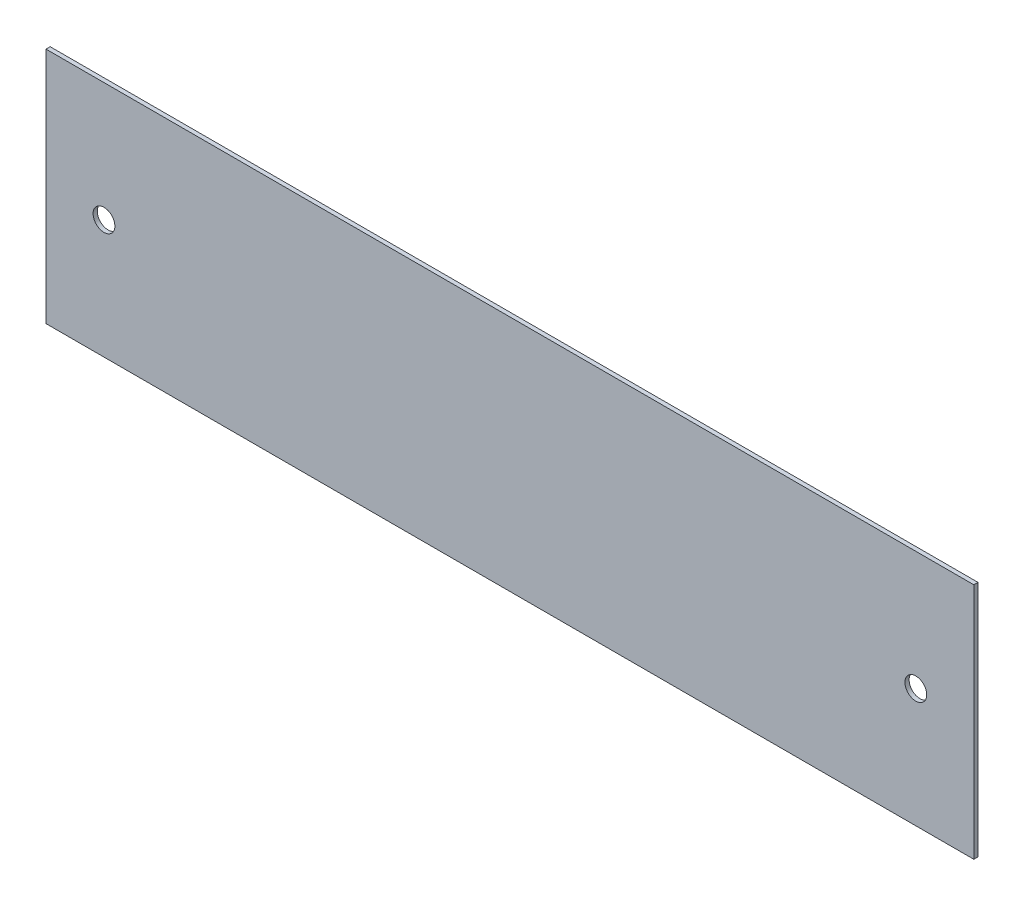
ISO-10303-21;
HEADER;
FILE_DESCRIPTION(('STEP AP214'),'2;1');
FILE_NAME('part.step','',(''),(''),'','','');
FILE_SCHEMA(('AUTOMOTIVE_DESIGN { 1 0 10303 214 1 1 1 1 }'));
ENDSEC;
DATA;
#1=APPLICATION_CONTEXT('core data for automotive mechanical design processes');
#2=APPLICATION_PROTOCOL_DEFINITION('international standard','automotive_design',2000,#1);
#3=PRODUCT_CONTEXT('',#1,'mechanical');
#4=PRODUCT('Part','Part','',(#3));
#5=PRODUCT_RELATED_PRODUCT_CATEGORY('part','',(#4));
#6=PRODUCT_DEFINITION_FORMATION('','',#4);
#7=PRODUCT_DEFINITION_CONTEXT('part definition',#1,'design');
#8=PRODUCT_DEFINITION('design','',#6,#7);
#9=PRODUCT_DEFINITION_SHAPE('','',#8);
#10=(LENGTH_UNIT() NAMED_UNIT(*) SI_UNIT(.MILLI.,.METRE.));
#11=(NAMED_UNIT(*) PLANE_ANGLE_UNIT() SI_UNIT($,.RADIAN.));
#12=(NAMED_UNIT(*) SI_UNIT($,.STERADIAN.) SOLID_ANGLE_UNIT());
#13=UNCERTAINTY_MEASURE_WITH_UNIT(LENGTH_MEASURE(1.E-05),#10,'distance_accuracy_value','');
#14=(GEOMETRIC_REPRESENTATION_CONTEXT(3) GLOBAL_UNCERTAINTY_ASSIGNED_CONTEXT((#13)) GLOBAL_UNIT_ASSIGNED_CONTEXT((#10,
#11,#12)) REPRESENTATION_CONTEXT('',''));
#15=CARTESIAN_POINT('',(0.,0.,0.));
#16=DIRECTION('',(0.,0.,1.));
#17=DIRECTION('',(1.,0.,0.));
#18=AXIS2_PLACEMENT_3D('',#15,#16,#17);
#19=CARTESIAN_POINT('',(144.,36.9,1.2954));
#20=DIRECTION('',(-1.,0.,0.));
#21=DIRECTION('',(0.,-1.,0.));
#22=AXIS2_PLACEMENT_3D('',#19,#20,#21);
#23=PLANE('',#22);
#24=DIRECTION('',(0.,1.,0.));
#25=VECTOR('',#24,1.);
#26=CARTESIAN_POINT('',(144.,36.9,0.));
#27=LINE('',#26,#25);
#28=CARTESIAN_POINT('',(144.,-36.9,0.));
#29=VERTEX_POINT('',#28);
#30=CARTESIAN_POINT('',(144.,36.9,0.));
#31=VERTEX_POINT('',#30);
#32=EDGE_CURVE('E96',#29,#31,#27,.T.);
#33=ORIENTED_EDGE('',*,*,#32,.T.);
#34=DIRECTION('',(0.,0.,-1.));
#35=VECTOR('',#34,1.);
#36=CARTESIAN_POINT('',(144.,36.9,1.2954));
#37=LINE('',#36,#35);
#38=CARTESIAN_POINT('',(144.,36.9,1.2954));
#39=VERTEX_POINT('',#38);
#40=EDGE_CURVE('E11',#39,#31,#37,.T.);
#41=ORIENTED_EDGE('',*,*,#40,.F.);
#42=DIRECTION('',(0.,1.,0.));
#43=VECTOR('',#42,1.);
#44=CARTESIAN_POINT('',(144.,36.9,1.2954));
#45=LINE('',#44,#43);
#46=CARTESIAN_POINT('',(144.,-36.9,1.2954));
#47=VERTEX_POINT('',#46);
#48=EDGE_CURVE('E84',#47,#39,#45,.T.);
#49=ORIENTED_EDGE('',*,*,#48,.F.);
#50=DIRECTION('',(0.,0.,-1.));
#51=VECTOR('',#50,1.);
#52=CARTESIAN_POINT('',(144.,-36.9,1.2954));
#53=LINE('',#52,#51);
#54=EDGE_CURVE('E92',#47,#29,#53,.T.);
#55=ORIENTED_EDGE('',*,*,#54,.T.);
#56=EDGE_LOOP('',(#33,#41,#49,#55));
#57=FACE_BOUND('',#56,.T.);
#58=ADVANCED_FACE('F33',(#57),#23,.F.);
#59=CARTESIAN_POINT('',(-144.,36.9,1.2954));
#60=DIRECTION('',(0.,-1.,0.));
#61=DIRECTION('',(0.,0.,-1.));
#62=AXIS2_PLACEMENT_3D('',#59,#60,#61);
#63=PLANE('',#62);
#64=DIRECTION('',(-1.,0.,0.));
#65=VECTOR('',#64,1.);
#66=CARTESIAN_POINT('',(-144.,36.9,0.));
#67=LINE('',#66,#65);
#68=CARTESIAN_POINT('',(-144.,36.9,0.));
#69=VERTEX_POINT('',#68);
#70=EDGE_CURVE('E88',#31,#69,#67,.T.);
#71=ORIENTED_EDGE('',*,*,#70,.T.);
#72=DIRECTION('',(0.,0.,-1.));
#73=VECTOR('',#72,1.);
#74=CARTESIAN_POINT('',(-144.,36.9,1.2954));
#75=LINE('',#74,#73);
#76=CARTESIAN_POINT('',(-144.,36.9,1.2954));
#77=VERTEX_POINT('',#76);
#78=EDGE_CURVE('E41',#77,#69,#75,.T.);
#79=ORIENTED_EDGE('',*,*,#78,.F.);
#80=DIRECTION('',(-1.,0.,0.));
#81=VECTOR('',#80,1.);
#82=CARTESIAN_POINT('',(-144.,36.9,1.2954));
#83=LINE('',#82,#81);
#84=EDGE_CURVE('E79',#39,#77,#83,.T.);
#85=ORIENTED_EDGE('',*,*,#84,.F.);
#86=ORIENTED_EDGE('',*,*,#40,.T.);
#87=EDGE_LOOP('',(#71,#79,#85,#86));
#88=FACE_BOUND('',#87,.T.);
#89=ADVANCED_FACE('F87',(#88),#63,.F.);
#90=CARTESIAN_POINT('',(-144.,36.9,1.2954));
#91=DIRECTION('',(1.,0.,0.));
#92=DIRECTION('',(0.,0.,-1.));
#93=AXIS2_PLACEMENT_3D('',#90,#91,#92);
#94=PLANE('',#93);
#95=DIRECTION('',(0.,-1.,0.));
#96=VECTOR('',#95,1.);
#97=CARTESIAN_POINT('',(-144.,36.9,0.));
#98=LINE('',#97,#96);
#99=CARTESIAN_POINT('',(-144.,-36.9,0.));
#100=VERTEX_POINT('',#99);
#101=EDGE_CURVE('E66',#69,#100,#98,.T.);
#102=ORIENTED_EDGE('',*,*,#101,.T.);
#103=DIRECTION('',(0.,0.,-1.));
#104=VECTOR('',#103,1.);
#105=CARTESIAN_POINT('',(-144.,-36.9,1.2954));
#106=LINE('',#105,#104);
#107=CARTESIAN_POINT('',(-144.,-36.9,1.2954));
#108=VERTEX_POINT('',#107);
#109=EDGE_CURVE('E89',#108,#100,#106,.T.);
#110=ORIENTED_EDGE('',*,*,#109,.F.);
#111=DIRECTION('',(0.,-1.,0.));
#112=VECTOR('',#111,1.);
#113=CARTESIAN_POINT('',(-144.,36.9,1.2954));
#114=LINE('',#113,#112);
#115=EDGE_CURVE('E82',#77,#108,#114,.T.);
#116=ORIENTED_EDGE('',*,*,#115,.F.);
#117=ORIENTED_EDGE('',*,*,#78,.T.);
#118=EDGE_LOOP('',(#102,#110,#116,#117));
#119=FACE_BOUND('',#118,.T.);
#120=ADVANCED_FACE('F90',(#119),#94,.F.);
#121=CARTESIAN_POINT('',(-144.,-36.9,1.2954));
#122=DIRECTION('',(0.,1.,0.));
#123=DIRECTION('',(0.,0.,1.));
#124=AXIS2_PLACEMENT_3D('',#121,#122,#123);
#125=PLANE('',#124);
#126=DIRECTION('',(1.,0.,0.));
#127=VECTOR('',#126,1.);
#128=CARTESIAN_POINT('',(-144.,-36.9,0.));
#129=LINE('',#128,#127);
#130=EDGE_CURVE('E72',#100,#29,#129,.T.);
#131=ORIENTED_EDGE('',*,*,#130,.T.);
#132=ORIENTED_EDGE('',*,*,#54,.F.);
#133=DIRECTION('',(1.,0.,0.));
#134=VECTOR('',#133,1.);
#135=CARTESIAN_POINT('',(-144.,-36.9,1.2954));
#136=LINE('',#135,#134);
#137=EDGE_CURVE('E49',#108,#47,#136,.T.);
#138=ORIENTED_EDGE('',*,*,#137,.F.);
#139=ORIENTED_EDGE('',*,*,#109,.T.);
#140=EDGE_LOOP('',(#131,#132,#138,#139));
#141=FACE_BOUND('',#140,.T.);
#142=ADVANCED_FACE('F104',(#141),#125,.F.);
#143=CARTESIAN_POINT('',(0.,0.,1.2954));
#144=DIRECTION('',(0.,0.,1.));
#145=DIRECTION('',(1.,0.,0.));
#146=AXIS2_PLACEMENT_3D('',#143,#144,#145);
#147=PLANE('',#146);
#148=CARTESIAN_POINT('',(-126.,0.,1.2954));
#149=DIRECTION('',(0.,0.,1.));
#150=DIRECTION('',(1.,0.,0.));
#151=AXIS2_PLACEMENT_3D('',#148,#149,#150);
#152=CIRCLE('',#151,3.37819999999998);
#153=CARTESIAN_POINT('',(-122.6218,0.,1.2954));
#154=VERTEX_POINT('',#153);
#155=EDGE_CURVE('E118',#154,#154,#152,.T.);
#156=ORIENTED_EDGE('',*,*,#155,.F.);
#157=EDGE_LOOP('',(#156));
#158=FACE_BOUND('',#157,.T.);
#159=CARTESIAN_POINT('',(126.,0.,1.2954));
#160=DIRECTION('',(0.,0.,1.));
#161=DIRECTION('',(1.,0.,0.));
#162=AXIS2_PLACEMENT_3D('',#159,#160,#161);
#163=CIRCLE('',#162,3.3782);
#164=CARTESIAN_POINT('',(129.3782,0.,1.2954));
#165=VERTEX_POINT('',#164);
#166=EDGE_CURVE('E112',#165,#165,#163,.T.);
#167=ORIENTED_EDGE('',*,*,#166,.F.);
#168=EDGE_LOOP('',(#167));
#169=FACE_BOUND('',#168,.T.);
#170=ORIENTED_EDGE('',*,*,#48,.T.);
#171=ORIENTED_EDGE('',*,*,#84,.T.);
#172=ORIENTED_EDGE('',*,*,#115,.T.);
#173=ORIENTED_EDGE('',*,*,#137,.T.);
#174=EDGE_LOOP('',(#170,#171,#172,#173));
#175=FACE_BOUND('',#174,.T.);
#176=ADVANCED_FACE('F80',(#158,#169,#175),#147,.T.);
#177=CARTESIAN_POINT('',(0.,0.,0.));
#178=DIRECTION('',(0.,0.,1.));
#179=DIRECTION('',(1.,0.,0.));
#180=AXIS2_PLACEMENT_3D('',#177,#178,#179);
#181=PLANE('',#180);
#182=CARTESIAN_POINT('',(-126.,0.,0.));
#183=DIRECTION('',(0.,0.,1.));
#184=DIRECTION('',(1.,0.,0.));
#185=AXIS2_PLACEMENT_3D('',#182,#183,#184);
#186=CIRCLE('',#185,3.3782);
#187=CARTESIAN_POINT('',(-122.6218,0.,0.));
#188=VERTEX_POINT('',#187);
#189=EDGE_CURVE('E115',#188,#188,#186,.T.);
#190=ORIENTED_EDGE('',*,*,#189,.T.);
#191=EDGE_LOOP('',(#190));
#192=FACE_BOUND('',#191,.T.);
#193=CARTESIAN_POINT('',(126.,0.,0.));
#194=DIRECTION('',(0.,0.,1.));
#195=DIRECTION('',(1.,0.,0.));
#196=AXIS2_PLACEMENT_3D('',#193,#194,#195);
#197=CIRCLE('',#196,3.3782);
#198=CARTESIAN_POINT('',(129.3782,0.,0.));
#199=VERTEX_POINT('',#198);
#200=EDGE_CURVE('E99',#199,#199,#197,.T.);
#201=ORIENTED_EDGE('',*,*,#200,.T.);
#202=EDGE_LOOP('',(#201));
#203=FACE_BOUND('',#202,.T.);
#204=ORIENTED_EDGE('',*,*,#32,.F.);
#205=ORIENTED_EDGE('',*,*,#130,.F.);
#206=ORIENTED_EDGE('',*,*,#101,.F.);
#207=ORIENTED_EDGE('',*,*,#70,.F.);
#208=EDGE_LOOP('',(#204,#205,#206,#207));
#209=FACE_BOUND('',#208,.T.);
#210=ADVANCED_FACE('F107',(#192,#203,#209),#181,.F.);
#211=CARTESIAN_POINT('',(126.,0.,1.2954));
#212=DIRECTION('',(0.,0.,1.));
#213=DIRECTION('',(1.,0.,0.));
#214=AXIS2_PLACEMENT_3D('',#211,#212,#213);
#215=CYLINDRICAL_SURFACE('',#214,3.3782);
#216=ORIENTED_EDGE('',*,*,#200,.F.);
#217=EDGE_LOOP('',(#216));
#218=FACE_BOUND('',#217,.T.);
#219=ORIENTED_EDGE('',*,*,#166,.T.);
#220=EDGE_LOOP('',(#219));
#221=FACE_BOUND('',#220,.T.);
#222=ADVANCED_FACE('F129',(#218,#221),#215,.F.);
#223=CARTESIAN_POINT('',(-126.,0.,1.2954));
#224=DIRECTION('',(0.,0.,1.));
#225=DIRECTION('',(1.,0.,0.));
#226=AXIS2_PLACEMENT_3D('',#223,#224,#225);
#227=CYLINDRICAL_SURFACE('',#226,3.37819999999999);
#228=ORIENTED_EDGE('',*,*,#189,.F.);
#229=EDGE_LOOP('',(#228));
#230=FACE_BOUND('',#229,.T.);
#231=ORIENTED_EDGE('',*,*,#155,.T.);
#232=EDGE_LOOP('',(#231));
#233=FACE_BOUND('',#232,.T.);
#234=ADVANCED_FACE('F122',(#230,#233),#227,.F.);
#235=CLOSED_SHELL('',(#58,#89,#120,#142,#176,#210,#222,#234));
#236=MANIFOLD_SOLID_BREP('B2',#235);
#237=ADVANCED_BREP_SHAPE_REPRESENTATION('',(#18,#236),#14);
#238=SHAPE_DEFINITION_REPRESENTATION(#9,#237);
ENDSEC;
END-ISO-10303-21;
